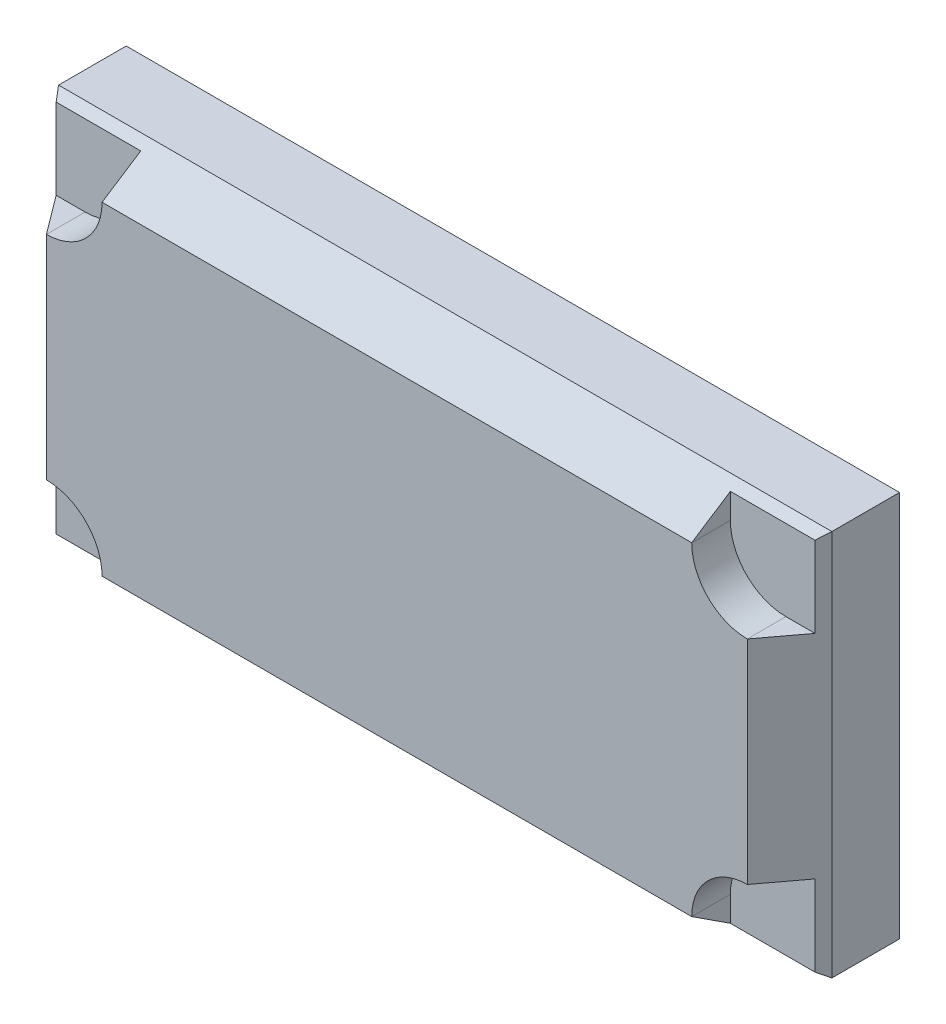
ISO-10303-21;
HEADER;
FILE_DESCRIPTION(('STEP AP214'),'2;1');
FILE_NAME('part.step','',(''),(''),'','','');
FILE_SCHEMA(('AUTOMOTIVE_DESIGN { 1 0 10303 214 1 1 1 1 }'));
ENDSEC;
DATA;
#1=APPLICATION_CONTEXT('core data for automotive mechanical design processes');
#2=APPLICATION_PROTOCOL_DEFINITION('international standard','automotive_design',2000,#1);
#3=PRODUCT_CONTEXT('',#1,'mechanical');
#4=PRODUCT('Part','Part','',(#3));
#5=PRODUCT_RELATED_PRODUCT_CATEGORY('part','',(#4));
#6=PRODUCT_DEFINITION_FORMATION('','',#4);
#7=PRODUCT_DEFINITION_CONTEXT('part definition',#1,'design');
#8=PRODUCT_DEFINITION('design','',#6,#7);
#9=PRODUCT_DEFINITION_SHAPE('','',#8);
#10=(LENGTH_UNIT() NAMED_UNIT(*) SI_UNIT(.MILLI.,.METRE.));
#11=(NAMED_UNIT(*) PLANE_ANGLE_UNIT() SI_UNIT($,.RADIAN.));
#12=(NAMED_UNIT(*) SI_UNIT($,.STERADIAN.) SOLID_ANGLE_UNIT());
#13=UNCERTAINTY_MEASURE_WITH_UNIT(LENGTH_MEASURE(1.E-05),#10,'distance_accuracy_value','');
#14=(GEOMETRIC_REPRESENTATION_CONTEXT(3) GLOBAL_UNCERTAINTY_ASSIGNED_CONTEXT((#13)) GLOBAL_UNIT_ASSIGNED_CONTEXT((#10,
#11,#12)) REPRESENTATION_CONTEXT('',''));
#15=CARTESIAN_POINT('',(0.,0.,0.));
#16=DIRECTION('',(0.,0.,1.));
#17=DIRECTION('',(1.,0.,0.));
#18=AXIS2_PLACEMENT_3D('',#15,#16,#17);
#19=CARTESIAN_POINT('',(0.,0.,5.99999308));
#20=DIRECTION('',(0.,0.,-1.));
#21=DIRECTION('',(-1.,0.,0.));
#22=AXIS2_PLACEMENT_3D('',#19,#20,#21);
#23=PLANE('',#22);
#24=CARTESIAN_POINT('',(18.12500058,-8.37500001400001,5.99999308));
#25=DIRECTION('',(0.,0.,-1.));
#26=DIRECTION('',(-1.,0.,0.));
#27=AXIS2_PLACEMENT_3D('',#24,#25,#26);
#28=CIRCLE('',#27,2.87499831400001);
#29=CARTESIAN_POINT('',(18.12500058,-5.5000017,5.99999308000001));
#30=VERTEX_POINT('',#29);
#31=CARTESIAN_POINT('',(15.250002266,-8.375000014,5.99999308000001));
#32=VERTEX_POINT('',#31);
#33=EDGE_CURVE('E200',#30,#32,#28,.F.);
#34=ORIENTED_EDGE('',*,*,#33,.F.);
#35=DIRECTION('',(0.,1.,0.));
#36=VECTOR('',#35,1.);
#37=CARTESIAN_POINT('',(18.12500058,-8.375000014,5.99999308));
#38=LINE('',#37,#36);
#39=CARTESIAN_POINT('',(18.12500058,5.5000017,5.99999308000001));
#40=VERTEX_POINT('',#39);
#41=EDGE_CURVE('E273',#30,#40,#38,.T.);
#42=ORIENTED_EDGE('',*,*,#41,.T.);
#43=CARTESIAN_POINT('',(18.12500058,8.37500001400001,5.99999308));
#44=DIRECTION('',(0.,0.,-1.));
#45=DIRECTION('',(-1.,0.,0.));
#46=AXIS2_PLACEMENT_3D('',#43,#44,#45);
#47=CIRCLE('',#46,2.874998314);
#48=CARTESIAN_POINT('',(15.250002266,8.375000014,5.99999308));
#49=VERTEX_POINT('',#48);
#50=EDGE_CURVE('E222',#40,#49,#47,.T.);
#51=ORIENTED_EDGE('',*,*,#50,.T.);
#52=DIRECTION('',(-1.,0.,0.));
#53=VECTOR('',#52,1.);
#54=CARTESIAN_POINT('',(-18.12500058,8.375000014,5.99999308));
#55=LINE('',#54,#53);
#56=CARTESIAN_POINT('',(-15.250002266,8.375000014,5.99999308));
#57=VERTEX_POINT('',#56);
#58=EDGE_CURVE('E358',#49,#57,#55,.T.);
#59=ORIENTED_EDGE('',*,*,#58,.T.);
#60=CARTESIAN_POINT('',(-18.12500058,8.375000014,5.99999308));
#61=DIRECTION('',(0.,0.,-1.));
#62=DIRECTION('',(-1.,0.,0.));
#63=AXIS2_PLACEMENT_3D('',#60,#61,#62);
#64=CIRCLE('',#63,2.874998314);
#65=CARTESIAN_POINT('',(-18.12500058,5.5000017,5.99999308));
#66=VERTEX_POINT('',#65);
#67=EDGE_CURVE('E270',#66,#57,#64,.F.);
#68=ORIENTED_EDGE('',*,*,#67,.F.);
#69=DIRECTION('',(0.,-1.,0.));
#70=VECTOR('',#69,1.);
#71=CARTESIAN_POINT('',(-18.12500058,-8.375000014,5.99999308));
#72=LINE('',#71,#70);
#73=CARTESIAN_POINT('',(-18.12500058,-5.5000017,5.99999308));
#74=VERTEX_POINT('',#73);
#75=EDGE_CURVE('E388',#66,#74,#72,.T.);
#76=ORIENTED_EDGE('',*,*,#75,.T.);
#77=CARTESIAN_POINT('',(-18.12500058,-8.375000014,5.99999308));
#78=DIRECTION('',(0.,0.,-1.));
#79=DIRECTION('',(-1.,0.,0.));
#80=AXIS2_PLACEMENT_3D('',#77,#78,#79);
#81=CIRCLE('',#80,2.874998314);
#82=CARTESIAN_POINT('',(-15.250002266,-8.375000014,5.99999308000001));
#83=VERTEX_POINT('',#82);
#84=EDGE_CURVE('E248',#83,#74,#81,.F.);
#85=ORIENTED_EDGE('',*,*,#84,.F.);
#86=DIRECTION('',(1.,0.,0.));
#87=VECTOR('',#86,1.);
#88=CARTESIAN_POINT('',(-18.12500058,-8.375000014,5.99999308));
#89=LINE('',#88,#87);
#90=EDGE_CURVE('E46',#83,#32,#89,.T.);
#91=ORIENTED_EDGE('',*,*,#90,.T.);
#92=EDGE_LOOP('',(#34,#42,#51,#59,#68,#76,#85,#91));
#93=FACE_BOUND('',#92,.T.);
#94=ADVANCED_FACE('F42',(#93),#23,.F.);
#95=CARTESIAN_POINT('',(0.,-8.62920027904067,5.60891091996552));
#96=DIRECTION('',(0.,-0.838446691373688,0.544983619684588));
#97=DIRECTION('',(0.,-0.544983619684588,-0.838446691373688));
#98=AXIS2_PLACEMENT_3D('',#95,#96,#97);
#99=PLANE('',#98);
#100=DIRECTION('',(-1.,0.,0.));
#101=VECTOR('',#100,1.);
#102=CARTESIAN_POINT('',(0.,-9.67498466319185,3.999992));
#103=LINE('',#102,#101);
#104=CARTESIAN_POINT('',(19.6249688779835,-9.67498466319185,3.999992));
#105=VERTEX_POINT('',#104);
#106=CARTESIAN_POINT('',(15.250002266,-9.67498466319185,3.999992));
#107=VERTEX_POINT('',#106);
#108=EDGE_CURVE('E60',#105,#107,#103,.T.);
#109=ORIENTED_EDGE('',*,*,#108,.T.);
#110=DIRECTION('',(0.,0.544983619684588,0.838446691373688));
#111=VECTOR('',#110,1.);
#112=CARTESIAN_POINT('',(15.250002266,-8.62920027904067,5.60891091996552));
#113=LINE('',#112,#111);
#114=EDGE_CURVE('E12',#107,#32,#113,.T.);
#115=ORIENTED_EDGE('',*,*,#114,.T.);
#116=ORIENTED_EDGE('',*,*,#90,.F.);
#117=DIRECTION('',(0.,-0.544983619684588,-0.838446691373688));
#118=VECTOR('',#117,1.);
#119=CARTESIAN_POINT('',(-15.250002266,-8.62920027904067,5.60891091996552));
#120=LINE('',#119,#118);
#121=CARTESIAN_POINT('',(-15.250002266,-9.67498466319185,3.999992));
#122=VERTEX_POINT('',#121);
#123=EDGE_CURVE('E481',#83,#122,#120,.T.);
#124=ORIENTED_EDGE('',*,*,#123,.T.);
#125=DIRECTION('',(-1.,0.,0.));
#126=VECTOR('',#125,1.);
#127=CARTESIAN_POINT('',(0.,-9.67498466319185,3.999992));
#128=LINE('',#127,#126);
#129=CARTESIAN_POINT('',(-19.6249688779835,-9.67498466319185,3.999992));
#130=VERTEX_POINT('',#129);
#131=EDGE_CURVE('E476',#122,#130,#128,.T.);
#132=ORIENTED_EDGE('',*,*,#131,.T.);
#133=DIRECTION('',(-0.532323211305287,-0.461351085910083,-0.709779665977558));
#134=VECTOR('',#133,1.);
#135=CARTESIAN_POINT('',(-18.12500058,-8.375000014,5.99999308));
#136=LINE('',#135,#134);
#137=CARTESIAN_POINT('',(-19.99996,-9.99998,3.499993));
#138=VERTEX_POINT('',#137);
#139=EDGE_CURVE('E472',#130,#138,#136,.T.);
#140=ORIENTED_EDGE('',*,*,#139,.T.);
#141=DIRECTION('',(1.,0.,0.));
#142=VECTOR('',#141,1.);
#143=CARTESIAN_POINT('',(0.,-9.99998,3.499993));
#144=LINE('',#143,#142);
#145=CARTESIAN_POINT('',(19.99996,-9.99998,3.499993));
#146=VERTEX_POINT('',#145);
#147=EDGE_CURVE('E429',#138,#146,#144,.T.);
#148=ORIENTED_EDGE('',*,*,#147,.T.);
#149=DIRECTION('',(0.532323211305287,-0.461351085910083,-0.709779665977558));
#150=VECTOR('',#149,1.);
#151=CARTESIAN_POINT('',(18.12500058,-8.375000014,5.99999308));
#152=LINE('',#151,#150);
#153=EDGE_CURVE('E402',#105,#146,#152,.T.);
#154=ORIENTED_EDGE('',*,*,#153,.F.);
#155=EDGE_LOOP('',(#109,#115,#116,#124,#132,#140,#148,#154));
#156=FACE_BOUND('',#155,.T.);
#157=ADVANCED_FACE('F284',(#156),#99,.T.);
#158=CARTESIAN_POINT('',(0.,8.62920027904065,5.60891091996552));
#159=DIRECTION('',(0.,0.838446691373687,0.544983619684589));
#160=DIRECTION('',(0.,-0.544983619684589,0.838446691373688));
#161=AXIS2_PLACEMENT_3D('',#158,#159,#160);
#162=PLANE('',#161);
#163=ORIENTED_EDGE('',*,*,#58,.F.);
#164=DIRECTION('',(0.,0.544983619684589,-0.838446691373688));
#165=VECTOR('',#164,1.);
#166=CARTESIAN_POINT('',(15.250002266,8.62920027904065,5.60891091996552));
#167=LINE('',#166,#165);
#168=CARTESIAN_POINT('',(15.250002266,9.67498466319184,3.999992));
#169=VERTEX_POINT('',#168);
#170=EDGE_CURVE('E366',#49,#169,#167,.T.);
#171=ORIENTED_EDGE('',*,*,#170,.T.);
#172=DIRECTION('',(1.,0.,0.));
#173=VECTOR('',#172,1.);
#174=CARTESIAN_POINT('',(0.,9.67498466319184,3.999992));
#175=LINE('',#174,#173);
#176=CARTESIAN_POINT('',(19.6249688779835,9.67498466319185,3.999992));
#177=VERTEX_POINT('',#176);
#178=EDGE_CURVE('E219',#169,#177,#175,.T.);
#179=ORIENTED_EDGE('',*,*,#178,.T.);
#180=DIRECTION('',(0.532323211305287,0.461351085910084,-0.709779665977558));
#181=VECTOR('',#180,1.);
#182=CARTESIAN_POINT('',(18.12500058,8.375000014,5.99999308));
#183=LINE('',#182,#181);
#184=CARTESIAN_POINT('',(19.99996,9.99998,3.499993));
#185=VERTEX_POINT('',#184);
#186=EDGE_CURVE('E384',#177,#185,#183,.T.);
#187=ORIENTED_EDGE('',*,*,#186,.T.);
#188=DIRECTION('',(1.,0.,0.));
#189=VECTOR('',#188,1.);
#190=CARTESIAN_POINT('',(-19.99996,9.99998,3.499993));
#191=LINE('',#190,#189);
#192=CARTESIAN_POINT('',(-19.99996,9.99998,3.499993));
#193=VERTEX_POINT('',#192);
#194=EDGE_CURVE('E422',#193,#185,#191,.T.);
#195=ORIENTED_EDGE('',*,*,#194,.F.);
#196=DIRECTION('',(-0.532323211305287,0.461351085910084,-0.709779665977558));
#197=VECTOR('',#196,1.);
#198=CARTESIAN_POINT('',(-18.12500058,8.375000014,5.99999308));
#199=LINE('',#198,#197);
#200=CARTESIAN_POINT('',(-19.6249688779835,9.67498466319184,3.999992));
#201=VERTEX_POINT('',#200);
#202=EDGE_CURVE('E387',#201,#193,#199,.T.);
#203=ORIENTED_EDGE('',*,*,#202,.F.);
#204=DIRECTION('',(1.,0.,0.));
#205=VECTOR('',#204,1.);
#206=CARTESIAN_POINT('',(0.,9.67498466319184,3.999992));
#207=LINE('',#206,#205);
#208=CARTESIAN_POINT('',(-15.250002266,9.67498466319184,3.999992));
#209=VERTEX_POINT('',#208);
#210=EDGE_CURVE('E274',#201,#209,#207,.T.);
#211=ORIENTED_EDGE('',*,*,#210,.T.);
#212=DIRECTION('',(0.,-0.544983619684589,0.838446691373688));
#213=VECTOR('',#212,1.);
#214=CARTESIAN_POINT('',(-15.250002266,8.62920027904065,5.60891091996552));
#215=LINE('',#214,#213);
#216=EDGE_CURVE('E482',#209,#57,#215,.T.);
#217=ORIENTED_EDGE('',*,*,#216,.T.);
#218=EDGE_LOOP('',(#163,#171,#179,#187,#195,#203,#211,#217));
#219=FACE_BOUND('',#218,.T.);
#220=ADVANCED_FACE('F294',(#219),#162,.T.);
#221=CARTESIAN_POINT('',(-19.99996,-9.99998,3.499993));
#222=DIRECTION('',(-1.,0.,0.));
#223=DIRECTION('',(0.,0.,1.));
#224=AXIS2_PLACEMENT_3D('',#221,#222,#223);
#225=PLANE('',#224);
#226=DIRECTION('',(0.,1.,0.));
#227=VECTOR('',#226,1.);
#228=CARTESIAN_POINT('',(-19.99996,-9.99998,0.));
#229=LINE('',#228,#227);
#230=CARTESIAN_POINT('',(-19.99996,-9.99998,0.));
#231=VERTEX_POINT('',#230);
#232=CARTESIAN_POINT('',(-19.99996,9.99998,0.));
#233=VERTEX_POINT('',#232);
#234=EDGE_CURVE('E495',#231,#233,#229,.T.);
#235=ORIENTED_EDGE('',*,*,#234,.F.);
#236=DIRECTION('',(0.,0.,-1.));
#237=VECTOR('',#236,1.);
#238=CARTESIAN_POINT('',(-19.99996,-9.99998,3.499993));
#239=LINE('',#238,#237);
#240=EDGE_CURVE('E500',#138,#231,#239,.T.);
#241=ORIENTED_EDGE('',*,*,#240,.F.);
#242=DIRECTION('',(0.,1.,0.));
#243=VECTOR('',#242,1.);
#244=CARTESIAN_POINT('',(-19.99996,-9.99998,3.499993));
#245=LINE('',#244,#243);
#246=EDGE_CURVE('E440',#138,#193,#245,.T.);
#247=ORIENTED_EDGE('',*,*,#246,.T.);
#248=DIRECTION('',(0.,0.,-1.));
#249=VECTOR('',#248,1.);
#250=CARTESIAN_POINT('',(-19.99996,9.99998,3.499993));
#251=LINE('',#250,#249);
#252=EDGE_CURVE('E437',#193,#233,#251,.T.);
#253=ORIENTED_EDGE('',*,*,#252,.T.);
#254=EDGE_LOOP('',(#235,#241,#247,#253));
#255=FACE_BOUND('',#254,.T.);
#256=ADVANCED_FACE('F44',(#255),#225,.T.);
#257=CARTESIAN_POINT('',(-19.99996,-9.99998,3.499993));
#258=DIRECTION('',(0.,1.,0.));
#259=DIRECTION('',(0.,0.,1.));
#260=AXIS2_PLACEMENT_3D('',#257,#258,#259);
#261=PLANE('',#260);
#262=DIRECTION('',(1.,0.,0.));
#263=VECTOR('',#262,1.);
#264=CARTESIAN_POINT('',(-19.99996,-9.99998,0.));
#265=LINE('',#264,#263);
#266=CARTESIAN_POINT('',(19.99996,-9.99998,0.));
#267=VERTEX_POINT('',#266);
#268=EDGE_CURVE('E442',#231,#267,#265,.T.);
#269=ORIENTED_EDGE('',*,*,#268,.T.);
#270=DIRECTION('',(0.,0.,-1.));
#271=VECTOR('',#270,1.);
#272=CARTESIAN_POINT('',(19.99996,-9.99998,3.499993));
#273=LINE('',#272,#271);
#274=EDGE_CURVE('E436',#146,#267,#273,.T.);
#275=ORIENTED_EDGE('',*,*,#274,.F.);
#276=ORIENTED_EDGE('',*,*,#147,.F.);
#277=ORIENTED_EDGE('',*,*,#240,.T.);
#278=EDGE_LOOP('',(#269,#275,#276,#277));
#279=FACE_BOUND('',#278,.T.);
#280=ADVANCED_FACE('F305',(#279),#261,.F.);
#281=CARTESIAN_POINT('',(19.99996,-9.99998,3.499993));
#282=DIRECTION('',(-1.,0.,0.));
#283=DIRECTION('',(0.,0.,1.));
#284=AXIS2_PLACEMENT_3D('',#281,#282,#283);
#285=PLANE('',#284);
#286=DIRECTION('',(0.,1.,0.));
#287=VECTOR('',#286,1.);
#288=CARTESIAN_POINT('',(19.99996,-9.99998,0.));
#289=LINE('',#288,#287);
#290=CARTESIAN_POINT('',(19.99996,9.99998,0.));
#291=VERTEX_POINT('',#290);
#292=EDGE_CURVE('E434',#267,#291,#289,.T.);
#293=ORIENTED_EDGE('',*,*,#292,.T.);
#294=DIRECTION('',(0.,0.,-1.));
#295=VECTOR('',#294,1.);
#296=CARTESIAN_POINT('',(19.99996,9.99998,3.499993));
#297=LINE('',#296,#295);
#298=EDGE_CURVE('E432',#185,#291,#297,.T.);
#299=ORIENTED_EDGE('',*,*,#298,.F.);
#300=DIRECTION('',(0.,1.,0.));
#301=VECTOR('',#300,1.);
#302=CARTESIAN_POINT('',(19.99996,0.,3.499993));
#303=LINE('',#302,#301);
#304=EDGE_CURVE('E425',#146,#185,#303,.T.);
#305=ORIENTED_EDGE('',*,*,#304,.F.);
#306=ORIENTED_EDGE('',*,*,#274,.T.);
#307=EDGE_LOOP('',(#293,#299,#305,#306));
#308=FACE_BOUND('',#307,.T.);
#309=ADVANCED_FACE('F308',(#308),#285,.F.);
#310=CARTESIAN_POINT('',(-19.99996,9.99998,3.499993));
#311=DIRECTION('',(0.,1.,0.));
#312=DIRECTION('',(0.,0.,1.));
#313=AXIS2_PLACEMENT_3D('',#310,#311,#312);
#314=PLANE('',#313);
#315=DIRECTION('',(1.,0.,0.));
#316=VECTOR('',#315,1.);
#317=CARTESIAN_POINT('',(-19.99996,9.99998,0.));
#318=LINE('',#317,#316);
#319=EDGE_CURVE('E514',#233,#291,#318,.T.);
#320=ORIENTED_EDGE('',*,*,#319,.F.);
#321=ORIENTED_EDGE('',*,*,#252,.F.);
#322=ORIENTED_EDGE('',*,*,#194,.T.);
#323=ORIENTED_EDGE('',*,*,#298,.T.);
#324=EDGE_LOOP('',(#320,#321,#322,#323));
#325=FACE_BOUND('',#324,.T.);
#326=ADVANCED_FACE('F303',(#325),#314,.T.);
#327=CARTESIAN_POINT('',(0.,0.,0.));
#328=DIRECTION('',(0.,0.,-1.));
#329=DIRECTION('',(-1.,0.,0.));
#330=AXIS2_PLACEMENT_3D('',#327,#328,#329);
#331=PLANE('',#330);
#332=ORIENTED_EDGE('',*,*,#234,.T.);
#333=ORIENTED_EDGE('',*,*,#319,.T.);
#334=ORIENTED_EDGE('',*,*,#292,.F.);
#335=ORIENTED_EDGE('',*,*,#268,.F.);
#336=EDGE_LOOP('',(#332,#333,#334,#335));
#337=FACE_BOUND('',#336,.T.);
#338=ADVANCED_FACE('F299',(#337),#331,.T.);
#339=CARTESIAN_POINT('',(-14.4801605980889,0.,10.8598850590835));
#340=DIRECTION('',(0.800006242309212,0.,-0.59999167683085));
#341=DIRECTION('',(-0.59999167683085,0.,-0.800006242309212));
#342=AXIS2_PLACEMENT_3D('',#339,#340,#341);
#343=PLANE('',#342);
#344=DIRECTION('',(0.,-1.,0.));
#345=VECTOR('',#344,1.);
#346=CARTESIAN_POINT('',(-19.6249688779835,0.,3.999992));
#347=LINE('',#346,#345);
#348=CARTESIAN_POINT('',(-19.6249688779835,-5.5000017,3.999992));
#349=VERTEX_POINT('',#348);
#350=EDGE_CURVE('E245',#349,#130,#347,.T.);
#351=ORIENTED_EDGE('',*,*,#350,.F.);
#352=DIRECTION('',(0.59999167683085,0.,0.800006242309212));
#353=VECTOR('',#352,1.);
#354=CARTESIAN_POINT('',(-14.4801605980889,-5.50000169999999,10.8598850590835));
#355=LINE('',#354,#353);
#356=EDGE_CURVE('E393',#349,#74,#355,.T.);
#357=ORIENTED_EDGE('',*,*,#356,.T.);
#358=ORIENTED_EDGE('',*,*,#75,.F.);
#359=DIRECTION('',(-0.59999167683085,0.,-0.800006242309212));
#360=VECTOR('',#359,1.);
#361=CARTESIAN_POINT('',(-14.4801605980889,5.5000017,10.8598850590835));
#362=LINE('',#361,#360);
#363=CARTESIAN_POINT('',(-19.6249688779835,5.5000017,3.999992));
#364=VERTEX_POINT('',#363);
#365=EDGE_CURVE('E485',#66,#364,#362,.T.);
#366=ORIENTED_EDGE('',*,*,#365,.T.);
#367=DIRECTION('',(0.,-1.,0.));
#368=VECTOR('',#367,1.);
#369=CARTESIAN_POINT('',(-19.6249688779835,0.,3.999992));
#370=LINE('',#369,#368);
#371=EDGE_CURVE('E454',#201,#364,#370,.T.);
#372=ORIENTED_EDGE('',*,*,#371,.F.);
#373=ORIENTED_EDGE('',*,*,#202,.T.);
#374=ORIENTED_EDGE('',*,*,#246,.F.);
#375=ORIENTED_EDGE('',*,*,#139,.F.);
#376=EDGE_LOOP('',(#351,#357,#358,#366,#372,#373,#374,#375));
#377=FACE_BOUND('',#376,.T.);
#378=ADVANCED_FACE('F302',(#377),#343,.F.);
#379=CARTESIAN_POINT('',(14.4801605980889,0.,10.8598850590835));
#380=DIRECTION('',(0.800006242309212,0.,0.59999167683085));
#381=DIRECTION('',(0.59999167683085,0.,-0.800006242309212));
#382=AXIS2_PLACEMENT_3D('',#379,#380,#381);
#383=PLANE('',#382);
#384=DIRECTION('',(-0.59999167683085,0.,0.800006242309212));
#385=VECTOR('',#384,1.);
#386=CARTESIAN_POINT('',(14.4801605980889,-5.50000169999999,10.8598850590835));
#387=LINE('',#386,#385);
#388=CARTESIAN_POINT('',(19.6249688779835,-5.5000017,3.999992));
#389=VERTEX_POINT('',#388);
#390=EDGE_CURVE('E52',#389,#30,#387,.T.);
#391=ORIENTED_EDGE('',*,*,#390,.F.);
#392=DIRECTION('',(0.,-1.,0.));
#393=VECTOR('',#392,1.);
#394=CARTESIAN_POINT('',(19.6249688779835,0.,3.999992));
#395=LINE('',#394,#393);
#396=EDGE_CURVE('E185',#389,#105,#395,.T.);
#397=ORIENTED_EDGE('',*,*,#396,.T.);
#398=ORIENTED_EDGE('',*,*,#153,.T.);
#399=ORIENTED_EDGE('',*,*,#304,.T.);
#400=ORIENTED_EDGE('',*,*,#186,.F.);
#401=DIRECTION('',(0.,-1.,0.));
#402=VECTOR('',#401,1.);
#403=CARTESIAN_POINT('',(19.6249688779835,0.,3.999992));
#404=LINE('',#403,#402);
#405=CARTESIAN_POINT('',(19.6249688779835,5.5000017,3.999992));
#406=VERTEX_POINT('',#405);
#407=EDGE_CURVE('E390',#177,#406,#404,.T.);
#408=ORIENTED_EDGE('',*,*,#407,.T.);
#409=DIRECTION('',(0.59999167683085,0.,-0.800006242309212));
#410=VECTOR('',#409,1.);
#411=CARTESIAN_POINT('',(14.4801605980889,5.5000017,10.8598850590835));
#412=LINE('',#411,#410);
#413=EDGE_CURVE('E392',#40,#406,#412,.T.);
#414=ORIENTED_EDGE('',*,*,#413,.F.);
#415=ORIENTED_EDGE('',*,*,#41,.F.);
#416=EDGE_LOOP('',(#391,#397,#398,#399,#400,#408,#414,#415));
#417=FACE_BOUND('',#416,.T.);
#418=ADVANCED_FACE('F296',(#417),#383,.T.);
#419=CARTESIAN_POINT('',(0.,5.5000017,6.00009308));
#420=DIRECTION('',(0.,-1.,0.));
#421=DIRECTION('',(0.,0.,-1.));
#422=AXIS2_PLACEMENT_3D('',#419,#420,#421);
#423=PLANE('',#422);
#424=DIRECTION('',(0.,0.,-1.));
#425=VECTOR('',#424,1.);
#426=CARTESIAN_POINT('',(-18.12500058,5.5000017,6.00009308));
#427=LINE('',#426,#425);
#428=CARTESIAN_POINT('',(-18.12500058,5.5000017,3.999992));
#429=VERTEX_POINT('',#428);
#430=EDGE_CURVE('E269',#66,#429,#427,.T.);
#431=ORIENTED_EDGE('',*,*,#430,.T.);
#432=DIRECTION('',(-1.,0.,0.));
#433=VECTOR('',#432,1.);
#434=CARTESIAN_POINT('',(0.,5.5000017,3.999992));
#435=LINE('',#434,#433);
#436=EDGE_CURVE('E250',#429,#364,#435,.T.);
#437=ORIENTED_EDGE('',*,*,#436,.T.);
#438=ORIENTED_EDGE('',*,*,#365,.F.);
#439=EDGE_LOOP('',(#431,#437,#438));
#440=FACE_BOUND('',#439,.T.);
#441=ADVANCED_FACE('F325',(#440),#423,.F.);
#442=CARTESIAN_POINT('',(-18.12500058,8.375000014,6.00009308));
#443=DIRECTION('',(0.,0.,-1.));
#444=DIRECTION('',(-1.,0.,0.));
#445=AXIS2_PLACEMENT_3D('',#442,#443,#444);
#446=CYLINDRICAL_SURFACE('',#445,2.874998314);
#447=ORIENTED_EDGE('',*,*,#67,.T.);
#448=DIRECTION('',(0.,0.,-1.));
#449=VECTOR('',#448,1.);
#450=CARTESIAN_POINT('',(-15.250002266,8.375000014,6.00009308));
#451=LINE('',#450,#449);
#452=CARTESIAN_POINT('',(-15.250002266,8.375000014,3.999992));
#453=VERTEX_POINT('',#452);
#454=EDGE_CURVE('E261',#57,#453,#451,.T.);
#455=ORIENTED_EDGE('',*,*,#454,.T.);
#456=CARTESIAN_POINT('',(-18.12500058,8.375000014,3.999992));
#457=DIRECTION('',(0.,0.,1.));
#458=DIRECTION('',(1.,0.,0.));
#459=AXIS2_PLACEMENT_3D('',#456,#457,#458);
#460=CIRCLE('',#459,2.874998314);
#461=EDGE_CURVE('E255',#429,#453,#460,.T.);
#462=ORIENTED_EDGE('',*,*,#461,.F.);
#463=ORIENTED_EDGE('',*,*,#430,.F.);
#464=EDGE_LOOP('',(#447,#455,#462,#463));
#465=FACE_BOUND('',#464,.T.);
#466=ADVANCED_FACE('F523',(#465),#446,.F.);
#467=CARTESIAN_POINT('',(-15.250002266,0.,6.00009308));
#468=DIRECTION('',(-1.,0.,0.));
#469=DIRECTION('',(0.,0.,1.));
#470=AXIS2_PLACEMENT_3D('',#467,#468,#469);
#471=PLANE('',#470);
#472=DIRECTION('',(0.,1.,0.));
#473=VECTOR('',#472,1.);
#474=CARTESIAN_POINT('',(-15.250002266,0.,3.999992));
#475=LINE('',#474,#473);
#476=EDGE_CURVE('E258',#453,#209,#475,.T.);
#477=ORIENTED_EDGE('',*,*,#476,.F.);
#478=ORIENTED_EDGE('',*,*,#454,.F.);
#479=ORIENTED_EDGE('',*,*,#216,.F.);
#480=EDGE_LOOP('',(#477,#478,#479));
#481=FACE_BOUND('',#480,.T.);
#482=ADVANCED_FACE('F527',(#481),#471,.T.);
#483=CARTESIAN_POINT('',(0.,0.,3.999992));
#484=DIRECTION('',(0.,0.,1.));
#485=DIRECTION('',(1.,0.,0.));
#486=AXIS2_PLACEMENT_3D('',#483,#484,#485);
#487=PLANE('',#486);
#488=ORIENTED_EDGE('',*,*,#371,.T.);
#489=ORIENTED_EDGE('',*,*,#436,.F.);
#490=ORIENTED_EDGE('',*,*,#461,.T.);
#491=ORIENTED_EDGE('',*,*,#476,.T.);
#492=ORIENTED_EDGE('',*,*,#210,.F.);
#493=EDGE_LOOP('',(#488,#489,#490,#491,#492));
#494=FACE_BOUND('',#493,.T.);
#495=ADVANCED_FACE('F522',(#494),#487,.T.);
#496=CARTESIAN_POINT('',(0.,-5.50000169999996,3.999992));
#497=DIRECTION('',(0.,1.,0.));
#498=DIRECTION('',(-1.,0.,0.));
#499=AXIS2_PLACEMENT_3D('',#496,#497,#498);
#500=PLANE('',#499);
#501=DIRECTION('',(-1.,0.,0.));
#502=VECTOR('',#501,1.);
#503=CARTESIAN_POINT('',(0.,-5.50000169999996,3.999992));
#504=LINE('',#503,#502);
#505=CARTESIAN_POINT('',(-18.12500058,-5.5000017,3.999992));
#506=VERTEX_POINT('',#505);
#507=EDGE_CURVE('E230',#506,#349,#504,.T.);
#508=ORIENTED_EDGE('',*,*,#507,.F.);
#509=DIRECTION('',(0.,0.,1.));
#510=VECTOR('',#509,1.);
#511=CARTESIAN_POINT('',(-18.12500058,-5.5000017,3.999992));
#512=LINE('',#511,#510);
#513=EDGE_CURVE('E236',#506,#74,#512,.T.);
#514=ORIENTED_EDGE('',*,*,#513,.T.);
#515=ORIENTED_EDGE('',*,*,#356,.F.);
#516=EDGE_LOOP('',(#508,#514,#515));
#517=FACE_BOUND('',#516,.T.);
#518=ADVANCED_FACE('F534',(#517),#500,.F.);
#519=CARTESIAN_POINT('',(-18.12500058,-8.375000014,3.999992));
#520=DIRECTION('',(0.,0.,1.));
#521=DIRECTION('',(1.,0.,0.));
#522=AXIS2_PLACEMENT_3D('',#519,#520,#521);
#523=CYLINDRICAL_SURFACE('',#522,2.874998314);
#524=ORIENTED_EDGE('',*,*,#84,.T.);
#525=ORIENTED_EDGE('',*,*,#513,.F.);
#526=CARTESIAN_POINT('',(-18.12500058,-8.375000014,3.999992));
#527=DIRECTION('',(0.,0.,1.));
#528=DIRECTION('',(1.,0.,0.));
#529=AXIS2_PLACEMENT_3D('',#526,#527,#528);
#530=CIRCLE('',#529,2.874998314);
#531=CARTESIAN_POINT('',(-15.250002266,-8.375000014,3.999992));
#532=VERTEX_POINT('',#531);
#533=EDGE_CURVE('E225',#506,#532,#530,.F.);
#534=ORIENTED_EDGE('',*,*,#533,.T.);
#535=DIRECTION('',(0.,0.,1.));
#536=VECTOR('',#535,1.);
#537=CARTESIAN_POINT('',(-15.250002266,-8.375000014,3.999992));
#538=LINE('',#537,#536);
#539=EDGE_CURVE('E242',#532,#83,#538,.T.);
#540=ORIENTED_EDGE('',*,*,#539,.T.);
#541=EDGE_LOOP('',(#524,#525,#534,#540));
#542=FACE_BOUND('',#541,.T.);
#543=ADVANCED_FACE('F537',(#542),#523,.F.);
#544=CARTESIAN_POINT('',(0.,0.,3.999992));
#545=DIRECTION('',(0.,0.,1.));
#546=DIRECTION('',(1.,0.,0.));
#547=AXIS2_PLACEMENT_3D('',#544,#545,#546);
#548=PLANE('',#547);
#549=ORIENTED_EDGE('',*,*,#350,.T.);
#550=ORIENTED_EDGE('',*,*,#131,.F.);
#551=DIRECTION('',(0.,-1.,0.));
#552=VECTOR('',#551,1.);
#553=CARTESIAN_POINT('',(-15.250002266,0.,3.999992));
#554=LINE('',#553,#552);
#555=EDGE_CURVE('E233',#532,#122,#554,.T.);
#556=ORIENTED_EDGE('',*,*,#555,.F.);
#557=ORIENTED_EDGE('',*,*,#533,.F.);
#558=ORIENTED_EDGE('',*,*,#507,.T.);
#559=EDGE_LOOP('',(#549,#550,#556,#557,#558));
#560=FACE_BOUND('',#559,.T.);
#561=ADVANCED_FACE('F475',(#560),#548,.T.);
#562=CARTESIAN_POINT('',(-15.250002266,0.,3.999992));
#563=DIRECTION('',(-1.,0.,0.));
#564=DIRECTION('',(0.,0.,1.));
#565=AXIS2_PLACEMENT_3D('',#562,#563,#564);
#566=PLANE('',#565);
#567=ORIENTED_EDGE('',*,*,#539,.F.);
#568=ORIENTED_EDGE('',*,*,#555,.T.);
#569=ORIENTED_EDGE('',*,*,#123,.F.);
#570=EDGE_LOOP('',(#567,#568,#569));
#571=FACE_BOUND('',#570,.T.);
#572=ADVANCED_FACE('F544',(#571),#566,.T.);
#573=CARTESIAN_POINT('',(18.12500058,8.37500001400001,3.999992));
#574=DIRECTION('',(0.,0.,1.));
#575=DIRECTION('',(1.,0.,0.));
#576=AXIS2_PLACEMENT_3D('',#573,#574,#575);
#577=CYLINDRICAL_SURFACE('',#576,2.874998314);
#578=DIRECTION('',(0.,0.,1.));
#579=VECTOR('',#578,1.);
#580=CARTESIAN_POINT('',(18.12500058,5.5000017,3.999992));
#581=LINE('',#580,#579);
#582=CARTESIAN_POINT('',(18.12500058,5.5000017,3.999992));
#583=VERTEX_POINT('',#582);
#584=EDGE_CURVE('E216',#583,#40,#581,.T.);
#585=ORIENTED_EDGE('',*,*,#584,.F.);
#586=CARTESIAN_POINT('',(18.12500058,8.37500001400001,3.999992));
#587=DIRECTION('',(0.,0.,1.));
#588=DIRECTION('',(1.,0.,0.));
#589=AXIS2_PLACEMENT_3D('',#586,#587,#588);
#590=CIRCLE('',#589,2.874998314);
#591=CARTESIAN_POINT('',(15.250002266,8.375000014,3.999992));
#592=VERTEX_POINT('',#591);
#593=EDGE_CURVE('E207',#592,#583,#590,.T.);
#594=ORIENTED_EDGE('',*,*,#593,.F.);
#595=DIRECTION('',(0.,0.,1.));
#596=VECTOR('',#595,1.);
#597=CARTESIAN_POINT('',(15.250002266,8.375000014,3.999992));
#598=LINE('',#597,#596);
#599=EDGE_CURVE('E210',#592,#49,#598,.T.);
#600=ORIENTED_EDGE('',*,*,#599,.T.);
#601=ORIENTED_EDGE('',*,*,#50,.F.);
#602=EDGE_LOOP('',(#585,#594,#600,#601));
#603=FACE_BOUND('',#602,.T.);
#604=ADVANCED_FACE('F547',(#603),#577,.F.);
#605=CARTESIAN_POINT('',(15.250002266,0.,3.999992));
#606=DIRECTION('',(1.,0.,0.));
#607=DIRECTION('',(0.,0.,-1.));
#608=AXIS2_PLACEMENT_3D('',#605,#606,#607);
#609=PLANE('',#608);
#610=ORIENTED_EDGE('',*,*,#599,.F.);
#611=DIRECTION('',(0.,1.,0.));
#612=VECTOR('',#611,1.);
#613=CARTESIAN_POINT('',(15.250002266,0.,3.999992));
#614=LINE('',#613,#612);
#615=EDGE_CURVE('E202',#592,#169,#614,.T.);
#616=ORIENTED_EDGE('',*,*,#615,.T.);
#617=ORIENTED_EDGE('',*,*,#170,.F.);
#618=EDGE_LOOP('',(#610,#616,#617));
#619=FACE_BOUND('',#618,.T.);
#620=ADVANCED_FACE('F551',(#619),#609,.T.);
#621=CARTESIAN_POINT('',(0.,5.50000170000001,3.999992));
#622=DIRECTION('',(0.,-1.,0.));
#623=DIRECTION('',(1.,0.,0.));
#624=AXIS2_PLACEMENT_3D('',#621,#622,#623);
#625=PLANE('',#624);
#626=ORIENTED_EDGE('',*,*,#413,.T.);
#627=DIRECTION('',(1.,0.,0.));
#628=VECTOR('',#627,1.);
#629=CARTESIAN_POINT('',(0.,5.50000170000001,3.999992));
#630=LINE('',#629,#628);
#631=EDGE_CURVE('E68',#583,#406,#630,.T.);
#632=ORIENTED_EDGE('',*,*,#631,.F.);
#633=ORIENTED_EDGE('',*,*,#584,.T.);
#634=EDGE_LOOP('',(#626,#632,#633));
#635=FACE_BOUND('',#634,.T.);
#636=ADVANCED_FACE('F554',(#635),#625,.F.);
#637=CARTESIAN_POINT('',(0.,0.,3.999992));
#638=DIRECTION('',(0.,0.,1.));
#639=DIRECTION('',(1.,0.,0.));
#640=AXIS2_PLACEMENT_3D('',#637,#638,#639);
#641=PLANE('',#640);
#642=ORIENTED_EDGE('',*,*,#615,.F.);
#643=ORIENTED_EDGE('',*,*,#593,.T.);
#644=ORIENTED_EDGE('',*,*,#631,.T.);
#645=ORIENTED_EDGE('',*,*,#407,.F.);
#646=ORIENTED_EDGE('',*,*,#178,.F.);
#647=EDGE_LOOP('',(#642,#643,#644,#645,#646));
#648=FACE_BOUND('',#647,.T.);
#649=ADVANCED_FACE('F418',(#648),#641,.T.);
#650=CARTESIAN_POINT('',(18.12500058,-8.37500001400001,6.00009308));
#651=DIRECTION('',(0.,0.,-1.));
#652=DIRECTION('',(-1.,0.,0.));
#653=AXIS2_PLACEMENT_3D('',#650,#651,#652);
#654=CYLINDRICAL_SURFACE('',#653,2.87499831400001);
#655=ORIENTED_EDGE('',*,*,#33,.T.);
#656=DIRECTION('',(0.,0.,-1.));
#657=VECTOR('',#656,1.);
#658=CARTESIAN_POINT('',(15.250002266,-8.375000014,6.00009308));
#659=LINE('',#658,#657);
#660=CARTESIAN_POINT('',(15.250002266,-8.375000014,3.999992));
#661=VERTEX_POINT('',#660);
#662=EDGE_CURVE('E180',#32,#661,#659,.T.);
#663=ORIENTED_EDGE('',*,*,#662,.T.);
#664=CARTESIAN_POINT('',(18.12500058,-8.37500001400001,3.999992));
#665=DIRECTION('',(0.,0.,1.));
#666=DIRECTION('',(1.,0.,0.));
#667=AXIS2_PLACEMENT_3D('',#664,#665,#666);
#668=CIRCLE('',#667,2.87499831400001);
#669=CARTESIAN_POINT('',(18.12500058,-5.5000017,3.999992));
#670=VERTEX_POINT('',#669);
#671=EDGE_CURVE('E184',#670,#661,#668,.T.);
#672=ORIENTED_EDGE('',*,*,#671,.F.);
#673=DIRECTION('',(0.,0.,-1.));
#674=VECTOR('',#673,1.);
#675=CARTESIAN_POINT('',(18.12500058,-5.5000017,6.00009308));
#676=LINE('',#675,#674);
#677=EDGE_CURVE('E172',#30,#670,#676,.T.);
#678=ORIENTED_EDGE('',*,*,#677,.F.);
#679=EDGE_LOOP('',(#655,#663,#672,#678));
#680=FACE_BOUND('',#679,.T.);
#681=ADVANCED_FACE('F187',(#680),#654,.F.);
#682=CARTESIAN_POINT('',(0.,-5.50000169999996,6.00009308));
#683=DIRECTION('',(0.,1.,0.));
#684=DIRECTION('',(-1.,0.,0.));
#685=AXIS2_PLACEMENT_3D('',#682,#683,#684);
#686=PLANE('',#685);
#687=ORIENTED_EDGE('',*,*,#390,.T.);
#688=ORIENTED_EDGE('',*,*,#677,.T.);
#689=DIRECTION('',(1.,0.,0.));
#690=VECTOR('',#689,1.);
#691=CARTESIAN_POINT('',(0.,-5.50000169999996,3.999992));
#692=LINE('',#691,#690);
#693=EDGE_CURVE('E175',#670,#389,#692,.T.);
#694=ORIENTED_EDGE('',*,*,#693,.T.);
#695=EDGE_LOOP('',(#687,#688,#694));
#696=FACE_BOUND('',#695,.T.);
#697=ADVANCED_FACE('F174',(#696),#686,.F.);
#698=CARTESIAN_POINT('',(15.250002266,0.,6.00009308));
#699=DIRECTION('',(1.,0.,0.));
#700=DIRECTION('',(0.,0.,-1.));
#701=AXIS2_PLACEMENT_3D('',#698,#699,#700);
#702=PLANE('',#701);
#703=DIRECTION('',(0.,-1.,0.));
#704=VECTOR('',#703,1.);
#705=CARTESIAN_POINT('',(15.250002266,0.,3.999992));
#706=LINE('',#705,#704);
#707=EDGE_CURVE('E190',#661,#107,#706,.T.);
#708=ORIENTED_EDGE('',*,*,#707,.F.);
#709=ORIENTED_EDGE('',*,*,#662,.F.);
#710=ORIENTED_EDGE('',*,*,#114,.F.);
#711=EDGE_LOOP('',(#708,#709,#710));
#712=FACE_BOUND('',#711,.T.);
#713=ADVANCED_FACE('F565',(#712),#702,.T.);
#714=CARTESIAN_POINT('',(0.,0.,3.999992));
#715=DIRECTION('',(0.,0.,1.));
#716=DIRECTION('',(1.,0.,0.));
#717=AXIS2_PLACEMENT_3D('',#714,#715,#716);
#718=PLANE('',#717);
#719=ORIENTED_EDGE('',*,*,#396,.F.);
#720=ORIENTED_EDGE('',*,*,#693,.F.);
#721=ORIENTED_EDGE('',*,*,#671,.T.);
#722=ORIENTED_EDGE('',*,*,#707,.T.);
#723=ORIENTED_EDGE('',*,*,#108,.F.);
#724=EDGE_LOOP('',(#719,#720,#721,#722,#723));
#725=FACE_BOUND('',#724,.T.);
#726=ADVANCED_FACE('F183',(#725),#718,.T.);
#727=CLOSED_SHELL('',(#94,#157,#220,#256,#280,#309,#326,#338,#378,#418,#441,#466,#482,#495,#518,
#543,#561,#572,#604,#620,#636,#649,#681,#697,#713,#726));
#728=MANIFOLD_SOLID_BREP('B2',#727);
#729=ADVANCED_BREP_SHAPE_REPRESENTATION('',(#18,#728),#14);
#730=SHAPE_DEFINITION_REPRESENTATION(#9,#729);
ENDSEC;
END-ISO-10303-21;
